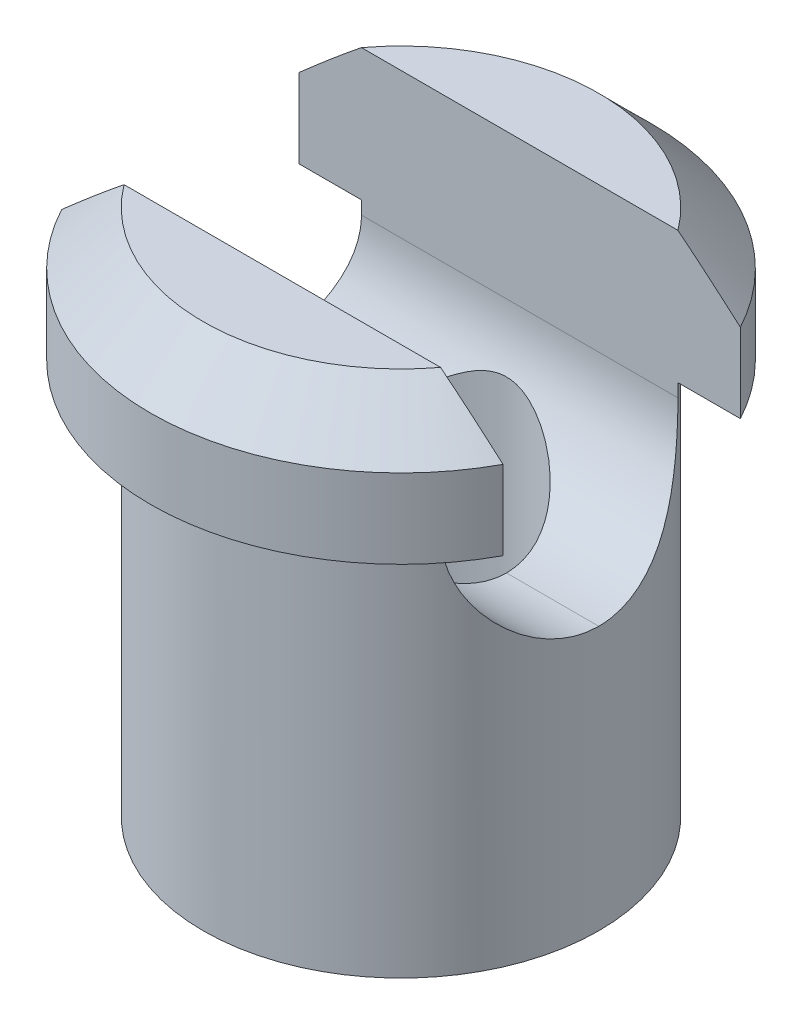
ISO-10303-21;
HEADER;
FILE_DESCRIPTION(('STEP AP214'),'2;1');
FILE_NAME('part.step','',(''),(''),'','','');
FILE_SCHEMA(('AUTOMOTIVE_DESIGN { 1 0 10303 214 1 1 1 1 }'));
ENDSEC;
DATA;
#1=APPLICATION_CONTEXT('core data for automotive mechanical design processes');
#2=APPLICATION_PROTOCOL_DEFINITION('international standard','automotive_design',2000,#1);
#3=PRODUCT_CONTEXT('',#1,'mechanical');
#4=PRODUCT('Part','Part','',(#3));
#5=PRODUCT_RELATED_PRODUCT_CATEGORY('part','',(#4));
#6=PRODUCT_DEFINITION_FORMATION('','',#4);
#7=PRODUCT_DEFINITION_CONTEXT('part definition',#1,'design');
#8=PRODUCT_DEFINITION('design','',#6,#7);
#9=PRODUCT_DEFINITION_SHAPE('','',#8);
#10=(LENGTH_UNIT() NAMED_UNIT(*) SI_UNIT(.MILLI.,.METRE.));
#11=(NAMED_UNIT(*) PLANE_ANGLE_UNIT() SI_UNIT($,.RADIAN.));
#12=(NAMED_UNIT(*) SI_UNIT($,.STERADIAN.) SOLID_ANGLE_UNIT());
#13=UNCERTAINTY_MEASURE_WITH_UNIT(LENGTH_MEASURE(1.E-05),#10,'distance_accuracy_value','');
#14=(GEOMETRIC_REPRESENTATION_CONTEXT(3) GLOBAL_UNCERTAINTY_ASSIGNED_CONTEXT((#13)) GLOBAL_UNIT_ASSIGNED_CONTEXT((#10,
#11,#12)) REPRESENTATION_CONTEXT('',''));
#15=CARTESIAN_POINT('',(0.,0.,0.));
#16=DIRECTION('',(0.,0.,1.));
#17=DIRECTION('',(1.,0.,0.));
#18=AXIS2_PLACEMENT_3D('',#15,#16,#17);
#19=CARTESIAN_POINT('',(7.5,15.,0.));
#20=DIRECTION('',(0.,1.,0.));
#21=DIRECTION('',(-1.,0.,0.));
#22=AXIS2_PLACEMENT_3D('',#19,#20,#21);
#23=PLANE('',#22);
#24=CARTESIAN_POINT('',(0.,15.,0.));
#25=DIRECTION('',(0.,1.,0.));
#26=DIRECTION('',(-1.,0.,0.));
#27=AXIS2_PLACEMENT_3D('',#24,#25,#26);
#28=CIRCLE('',#27,9.5);
#29=CARTESIAN_POINT('',(-8.36660026534076,15.,4.5));
#30=VERTEX_POINT('',#29);
#31=CARTESIAN_POINT('',(8.36660026534076,15.,4.5));
#32=VERTEX_POINT('',#31);
#33=EDGE_CURVE('E173',#30,#32,#28,.T.);
#34=ORIENTED_EDGE('',*,*,#33,.F.);
#35=DIRECTION('',(1.,0.,0.));
#36=VECTOR('',#35,1.);
#37=CARTESIAN_POINT('',(7.5,15.,4.5));
#38=LINE('',#37,#36);
#39=CARTESIAN_POINT('',(-6.,15.,4.5));
#40=VERTEX_POINT('',#39);
#41=EDGE_CURVE('E289',#30,#40,#38,.T.);
#42=ORIENTED_EDGE('',*,*,#41,.T.);
#43=CARTESIAN_POINT('',(0.,15.,0.));
#44=DIRECTION('',(0.,1.,0.));
#45=DIRECTION('',(-1.,0.,0.));
#46=AXIS2_PLACEMENT_3D('',#43,#44,#45);
#47=CIRCLE('',#46,7.5);
#48=CARTESIAN_POINT('',(6.,15.,4.5));
#49=VERTEX_POINT('',#48);
#50=EDGE_CURVE('E174',#40,#49,#47,.T.);
#51=ORIENTED_EDGE('',*,*,#50,.T.);
#52=EDGE_CURVE('E294',#49,#32,#38,.T.);
#53=ORIENTED_EDGE('',*,*,#52,.T.);
#54=EDGE_LOOP('',(#34,#42,#51,#53));
#55=FACE_BOUND('',#54,.T.);
#56=ADVANCED_FACE('F39',(#55),#23,.F.);
#57=CARTESIAN_POINT('',(0.,20.,0.));
#58=DIRECTION('',(0.,1.,0.));
#59=DIRECTION('',(-1.,0.,0.));
#60=AXIS2_PLACEMENT_3D('',#57,#58,#59);
#61=CYLINDRICAL_SURFACE('',#60,9.5);
#62=ORIENTED_EDGE('',*,*,#33,.T.);
#63=DIRECTION('',(0.,1.,0.));
#64=VECTOR('',#63,1.);
#65=CARTESIAN_POINT('',(8.36660026534076,20.,4.5));
#66=LINE('',#65,#64);
#67=CARTESIAN_POINT('',(8.36660026534076,18.,4.5));
#68=VERTEX_POINT('',#67);
#69=EDGE_CURVE('E297',#32,#68,#66,.T.);
#70=ORIENTED_EDGE('',*,*,#69,.T.);
#71=CARTESIAN_POINT('',(0.,18.,0.));
#72=DIRECTION('',(0.,1.,0.));
#73=DIRECTION('',(-1.,0.,0.));
#74=AXIS2_PLACEMENT_3D('',#71,#72,#73);
#75=CIRCLE('',#74,9.5);
#76=CARTESIAN_POINT('',(-8.36660026534076,18.,4.5));
#77=VERTEX_POINT('',#76);
#78=EDGE_CURVE('E162',#77,#68,#75,.T.);
#79=ORIENTED_EDGE('',*,*,#78,.F.);
#80=DIRECTION('',(0.,1.,0.));
#81=VECTOR('',#80,1.);
#82=CARTESIAN_POINT('',(-8.36660026534076,20.,4.5));
#83=LINE('',#82,#81);
#84=EDGE_CURVE('E137',#77,#30,#83,.F.);
#85=ORIENTED_EDGE('',*,*,#84,.T.);
#86=EDGE_LOOP('',(#62,#70,#79,#85));
#87=FACE_BOUND('',#86,.T.);
#88=ADVANCED_FACE('F312',(#87),#61,.T.);
#89=CARTESIAN_POINT('',(0.,18.,0.));
#90=DIRECTION('',(0.,-1.,0.));
#91=DIRECTION('',(1.,0.,0.));
#92=AXIS2_PLACEMENT_3D('',#89,#90,#91);
#93=CONICAL_SURFACE('',#92,9.5,0.785398163397449);
#94=ORIENTED_EDGE('',*,*,#78,.T.);
#95=CARTESIAN_POINT('',(8.36739508389559,17.9993,4.5));
#96=CARTESIAN_POINT('',(8.24484691919446,18.1072272297093,4.5));
#97=CARTESIAN_POINT('',(8.1220377160539,18.2148580709691,4.5));
#98=CARTESIAN_POINT('',(7.87582689736761,18.429443299208,4.5));
#99=CARTESIAN_POINT('',(7.75242527369194,18.5363976768568,4.5));
#100=CARTESIAN_POINT('',(7.3811300628873,18.8562033772271,4.5));
#101=CARTESIAN_POINT('',(7.13224632837708,19.0679087898725,4.5));
#102=CARTESIAN_POINT('',(6.62684988311126,19.4909014074442,4.5));
#103=CARTESIAN_POINT('',(6.37027945700601,19.7021198713915,4.5));
#104=CARTESIAN_POINT('',(5.85268429423352,20.1189195967068,4.5));
#105=CARTESIAN_POINT('',(5.59166061144087,20.3245021626086,4.5));
#106=CARTESIAN_POINT('',(5.06943073572236,20.7234779119315,4.5));
#107=CARTESIAN_POINT('',(4.8083546032396,20.9170396814306,4.5));
#108=CARTESIAN_POINT('',(4.41090845389738,21.1994056214214,4.5));
#109=CARTESIAN_POINT('',(4.27739880217188,21.2922343584723,4.5));
#110=CARTESIAN_POINT('',(4.00815368917608,21.4745984273772,4.5));
#111=CARTESIAN_POINT('',(3.87241837903649,21.5641339815229,4.5));
#112=CARTESIAN_POINT('',(3.599032487374,21.7387476654647,4.5));
#113=CARTESIAN_POINT('',(3.46139448927548,21.823845420172,4.5));
#114=CARTESIAN_POINT('',(3.18315198654476,21.9891085949656,4.5));
#115=CARTESIAN_POINT('',(3.04254715226672,22.0692734630409,4.5));
#116=CARTESIAN_POINT('',(2.75815917084868,22.223336853827,4.5));
#117=CARTESIAN_POINT('',(2.61438038120883,22.2972433669135,4.5));
#118=CARTESIAN_POINT('',(2.32313150811483,22.4373280666446,4.5));
#119=CARTESIAN_POINT('',(2.17566272047391,22.5035089213037,4.5));
#120=CARTESIAN_POINT('',(1.88623432994353,22.6223363709474,4.5));
#121=CARTESIAN_POINT('',(1.74452042133827,22.6755758809567,4.5));
#122=CARTESIAN_POINT('',(1.45759818366263,22.7717510084951,4.5));
#123=CARTESIAN_POINT('',(1.31238998422866,22.8146870076328,4.5));
#124=CARTESIAN_POINT('',(1.01967144860027,22.8880817033143,4.5));
#125=CARTESIAN_POINT('',(0.872178588657592,22.9186090195619,4.5));
#126=CARTESIAN_POINT('',(0.574971298223772,22.965786623751,4.5));
#127=CARTESIAN_POINT('',(0.42525719098821,22.9824389111341,4.5));
#128=CARTESIAN_POINT('',(0.123438288138011,23.0008507737561,4.5));
#129=CARTESIAN_POINT('',(-0.0286756144376807,23.0024644381601,4.5));
#130=CARTESIAN_POINT('',(-0.332279195748636,22.9903002271874,4.5));
#131=CARTESIAN_POINT('',(-0.483768844593605,22.9765216232043,4.5));
#132=CARTESIAN_POINT('',(-0.785377131595204,22.9344338258627,4.5));
#133=CARTESIAN_POINT('',(-0.935486520523537,22.9060594605829,4.5));
#134=CARTESIAN_POINT('',(-1.23265623196657,22.8364655604322,4.5));
#135=CARTESIAN_POINT('',(-1.37971603228179,22.7952438446898,4.5));
#136=CARTESIAN_POINT('',(-1.79353536396103,22.6624389693651,4.5));
#137=CARTESIAN_POINT('',(-2.05611389092435,22.5577822269071,4.5));
#138=CARTESIAN_POINT('',(-2.4410698008541,22.381817719934,4.5));
#139=CARTESIAN_POINT('',(-2.56802158092749,22.3199305832575,4.5));
#140=CARTESIAN_POINT('',(-2.81923944498322,22.190904466145,4.5));
#141=CARTESIAN_POINT('',(-2.94350578542213,22.1237659900603,4.5));
#142=CARTESIAN_POINT('',(-3.19085265476483,21.9844778477599,4.5));
#143=CARTESIAN_POINT('',(-3.31390803050425,21.9122839262557,4.5));
#144=CARTESIAN_POINT('',(-3.55781880473298,21.764261225469,4.5));
#145=CARTESIAN_POINT('',(-3.67867402737827,21.6884321573973,4.5));
#146=CARTESIAN_POINT('',(-4.03813473919927,21.4565845661693,4.5));
#147=CARTESIAN_POINT('',(-4.27384912359941,21.2960823793437,4.5));
#148=CARTESIAN_POINT('',(-4.67886036795023,21.0094659594567,4.5));
#149=CARTESIAN_POINT('',(-4.84951390703101,20.8852412102696,4.5));
#150=CARTESIAN_POINT('',(-5.18811523949353,20.6331417175974,4.5));
#151=CARTESIAN_POINT('',(-5.35606291709447,20.5052668185719,4.5));
#152=CARTESIAN_POINT('',(-5.68977686145292,20.2465551777567,4.5));
#153=CARTESIAN_POINT('',(-5.85554208962871,20.1157171010707,4.5));
#154=CARTESIAN_POINT('',(-6.18518437634805,19.851681865574,4.5));
#155=CARTESIAN_POINT('',(-6.34906140565359,19.718484670314,4.5));
#156=CARTESIAN_POINT('',(-6.66926786285808,19.4550537817244,4.5));
#157=CARTESIAN_POINT('',(-6.82565442329283,19.3248894180685,4.5));
#158=CARTESIAN_POINT('',(-7.13716501381201,19.0630569270435,4.5));
#159=CARTESIAN_POINT('',(-7.29228903154353,18.9313887849914,4.5));
#160=CARTESIAN_POINT('',(-7.60128256879623,18.6669309791805,4.5));
#161=CARTESIAN_POINT('',(-7.7551532764538,18.534142702068,4.5));
#162=CARTESIAN_POINT('',(-8.06194774727392,18.2674869096463,4.5));
#163=CARTESIAN_POINT('',(-8.21487154282353,18.1336194316134,4.5));
#164=CARTESIAN_POINT('',(-8.36739508389558,17.9993,4.5));
#165=B_SPLINE_CURVE_WITH_KNOTS('',3,(#95,#96,#97,#98,#99,#100,#101,#102,#103,#104,#105,#106,
#107,#108,#109,#110,#111,#112,#113,#114,#115,#116,#117,#118,#119,#120,#121,#122,#123,#124,#125,
#126,#127,#128,#129,#130,#131,#132,#133,#134,#135,#136,#137,#138,#139,#140,#141,#142,#143,#144,
#145,#146,#147,#148,#149,#150,#151,#152,#153,#154,#155,#156,#157,#158,#159,#160,#161,#162,#163,
#164),.UNSPECIFIED.,.F.,.F.,(4,2,2,2,2,2,2,2,2,2,2,2,2,2,2,2,2,2,2,2,2,2,2,2,2,2,2,2,2,2,2,2,2,
2,4),(0.,0.489894153909747,0.979795050092078,1.9599978180971,2.95692167158388,3.95361278600887,
4.92840150344141,5.41619368096687,5.90395287159404,6.38933112824629,6.874763602369,
7.35956664846183,7.84420177200372,8.29802972351968,8.75184086412734,9.2031071334878,
9.65430836250152,10.1098828247528,10.5654788529277,11.0231270645946,11.4808530056017,
12.3265013487016,12.7501457842116,13.1737495817332,13.6016888317825,14.0296621354083,
14.884869173537,15.5180643314824,16.1512865115713,16.784799864076,17.418323013137,
18.0287183007725,18.6391195534515,19.2488521108444,19.858563697173),.UNSPECIFIED.);
#166=CARTESIAN_POINT('',(5.99999999999999,20.,4.5));
#167=VERTEX_POINT('',#166);
#168=EDGE_CURVE('E145',#68,#167,#165,.T.);
#169=ORIENTED_EDGE('',*,*,#168,.T.);
#170=CARTESIAN_POINT('',(0.,20.,0.));
#171=DIRECTION('',(0.,1.,0.));
#172=DIRECTION('',(-1.,0.,0.));
#173=AXIS2_PLACEMENT_3D('',#170,#171,#172);
#174=CIRCLE('',#173,7.49999999999999);
#175=CARTESIAN_POINT('',(-5.99999999999999,20.,4.5));
#176=VERTEX_POINT('',#175);
#177=EDGE_CURVE('E149',#176,#167,#174,.T.);
#178=ORIENTED_EDGE('',*,*,#177,.F.);
#179=EDGE_CURVE('E130',#176,#77,#165,.T.);
#180=ORIENTED_EDGE('',*,*,#179,.T.);
#181=EDGE_LOOP('',(#94,#169,#178,#180));
#182=FACE_BOUND('',#181,.T.);
#183=ADVANCED_FACE('F154',(#182),#93,.T.);
#184=CARTESIAN_POINT('',(7.49999999999999,20.,0.));
#185=DIRECTION('',(0.,-1.,0.));
#186=DIRECTION('',(1.,0.,0.));
#187=AXIS2_PLACEMENT_3D('',#184,#185,#186);
#188=PLANE('',#187);
#189=ORIENTED_EDGE('',*,*,#177,.T.);
#190=DIRECTION('',(1.,0.,0.));
#191=VECTOR('',#190,1.);
#192=CARTESIAN_POINT('',(-9.5,20.,4.5));
#193=LINE('',#192,#191);
#194=EDGE_CURVE('E134',#176,#167,#193,.T.);
#195=ORIENTED_EDGE('',*,*,#194,.F.);
#196=EDGE_LOOP('',(#189,#195));
#197=FACE_BOUND('',#196,.T.);
#198=ADVANCED_FACE('F148',(#197),#188,.F.);
#199=CARTESIAN_POINT('',(0.,0.,0.));
#200=DIRECTION('',(0.,1.,0.));
#201=DIRECTION('',(-1.,0.,0.));
#202=AXIS2_PLACEMENT_3D('',#199,#200,#201);
#203=PLANE('',#202);
#204=CARTESIAN_POINT('',(0.,0.,0.));
#205=DIRECTION('',(0.,-1.,0.));
#206=DIRECTION('',(1.,0.,0.));
#207=AXIS2_PLACEMENT_3D('',#204,#205,#206);
#208=CIRCLE('',#207,4.);
#209=CARTESIAN_POINT('',(4.,0.,0.));
#210=VERTEX_POINT('',#209);
#211=EDGE_CURVE('E165',#210,#210,#208,.T.);
#212=ORIENTED_EDGE('',*,*,#211,.F.);
#213=EDGE_LOOP('',(#212));
#214=FACE_BOUND('',#213,.T.);
#215=CARTESIAN_POINT('',(0.,0.,0.));
#216=DIRECTION('',(0.,1.,0.));
#217=DIRECTION('',(-1.,0.,0.));
#218=AXIS2_PLACEMENT_3D('',#215,#216,#217);
#219=CIRCLE('',#218,7.5);
#220=CARTESIAN_POINT('',(-7.5,0.,0.));
#221=VERTEX_POINT('',#220);
#222=EDGE_CURVE('E178',#221,#221,#219,.T.);
#223=ORIENTED_EDGE('',*,*,#222,.F.);
#224=EDGE_LOOP('',(#223));
#225=FACE_BOUND('',#224,.T.);
#226=ADVANCED_FACE('F215',(#214,#225),#203,.F.);
#227=CARTESIAN_POINT('',(0.,20.,0.));
#228=DIRECTION('',(0.,1.,0.));
#229=DIRECTION('',(-1.,0.,0.));
#230=AXIS2_PLACEMENT_3D('',#227,#228,#229);
#231=CYLINDRICAL_SURFACE('',#230,7.5);
#232=DIRECTION('',(0.,1.,0.));
#233=VECTOR('',#232,1.);
#234=CARTESIAN_POINT('',(6.,20.,-4.5));
#235=LINE('',#234,#233);
#236=CARTESIAN_POINT('',(6.,15.,-4.5));
#237=VERTEX_POINT('',#236);
#238=CARTESIAN_POINT('',(6.,14.5,-4.5));
#239=VERTEX_POINT('',#238);
#240=EDGE_CURVE('E325',#237,#239,#235,.F.);
#241=ORIENTED_EDGE('',*,*,#240,.T.);
#242=CARTESIAN_POINT('',(6.,14.5,-4.5));
#243=CARTESIAN_POINT('',(5.99995179483679,14.3861873987763,-4.50002541288686));
#244=CARTESIAN_POINT('',(6.00323705584908,14.2724030969137,-4.49568328106251));
#245=CARTESIAN_POINT('',(6.01610753441909,14.0459483929675,-4.47846600678482));
#246=CARTESIAN_POINT('',(6.025686609677,13.9332770134618,-4.4655991837009));
#247=CARTESIAN_POINT('',(6.05067763750796,13.7107828937647,-4.43167158018456));
#248=CARTESIAN_POINT('',(6.06604181265092,13.6009444886329,-4.41067787838491));
#249=CARTESIAN_POINT('',(6.10197596202766,13.3839484347657,-4.36082960183109));
#250=CARTESIAN_POINT('',(6.12254698160926,13.2767913290918,-4.33197344848926));
#251=CARTESIAN_POINT('',(6.19081332781179,12.9611093782831,-4.23439881958348));
#252=CARTESIAN_POINT('',(6.24518632880575,12.757366926539,-4.15451599776942));
#253=CARTESIAN_POINT('',(6.36544732915564,12.3660260202434,-3.96779393040956));
#254=CARTESIAN_POINT('',(6.43136174731368,12.1784661113256,-3.86089258379867));
#255=CARTESIAN_POINT('',(6.57686634120047,11.8001400565597,-3.60812873696631));
#256=CARTESIAN_POINT('',(6.65714551946823,11.6117451042126,-3.45911303530544));
#257=CARTESIAN_POINT('',(6.81682191453012,11.2606290568208,-3.13271535629262));
#258=CARTESIAN_POINT('',(6.89621872431456,11.0979193870712,-2.95532082574971));
#259=CARTESIAN_POINT('',(7.01351141297607,10.8676030982223,-2.65962435942805));
#260=CARTESIAN_POINT('',(7.05415611776732,10.7898902981874,-2.55014303201056));
#261=CARTESIAN_POINT('',(7.13191893359114,10.6440852929838,-2.32379527903087));
#262=CARTESIAN_POINT('',(7.16903862261435,10.5759887763257,-2.20693219733319));
#263=CARTESIAN_POINT('',(7.23864595048767,10.4502182260111,-1.96663046048815));
#264=CARTESIAN_POINT('',(7.27114002970855,10.3925296705012,-1.84320128327493));
#265=CARTESIAN_POINT('',(7.33055492432762,10.2882458748013,-1.59052912216705));
#266=CARTESIAN_POINT('',(7.35747971475215,10.241642718926,-1.46129036556546));
#267=CARTESIAN_POINT('',(7.4003192525882,10.1680911165991,-1.22348789765087));
#268=CARTESIAN_POINT('',(7.41735622916451,10.1390846556363,-1.11575814227692));
#269=CARTESIAN_POINT('',(7.44687391073794,10.0890661862603,-0.897861074125226));
#270=CARTESIAN_POINT('',(7.45935570869715,10.0680522600804,-0.787694352806359));
#271=CARTESIAN_POINT('',(7.47951920353889,10.0341961272988,-0.565086649148773));
#272=CARTESIAN_POINT('',(7.48717574377888,10.0213967412209,-0.452636852020267));
#273=CARTESIAN_POINT('',(7.49742873390927,10.0042859419325,-0.226795824857999));
#274=CARTESIAN_POINT('',(7.50002204273153,9.99997979764293,-0.113404054224077));
#275=CARTESIAN_POINT('',(7.5,10.,0.));
#276=B_SPLINE_CURVE_WITH_KNOTS('',3,(#242,#243,#244,#245,#246,#247,#248,#249,#250,#251,#252,
#253,#254,#255,#256,#257,#258,#259,#260,#261,#262,#263,#264,#265,#266,#267,#268,#269,#270,#271,
#272,#273,#274,#275),.UNSPECIFIED.,.F.,.F.,(4,2,2,2,2,2,2,2,2,2,2,2,2,2,2,2,4),(0.,
0.341261757773518,0.68219096287419,1.02036418469491,1.35860535350921,2.03204615815233,
2.70704914593942,3.46393656597491,4.22115972074908,4.64150857043903,5.06166835299513,
5.48123728995438,5.90050572234968,6.23870881062981,6.57683069758032,6.91670112023389,
7.25678232080459),.UNSPECIFIED.);
#277=CARTESIAN_POINT('',(7.5,10.,0.));
#278=VERTEX_POINT('',#277);
#279=EDGE_CURVE('E64',#239,#278,#276,.T.);
#280=ORIENTED_EDGE('',*,*,#279,.T.);
#281=CARTESIAN_POINT('',(7.5,10.,0.));
#282=CARTESIAN_POINT('',(7.50002325630694,9.99997895327912,0.115712044065046));
#283=CARTESIAN_POINT('',(7.49732280902084,10.0044624241488,0.231408543481362));
#284=CARTESIAN_POINT('',(7.48664991104625,10.0222751572515,0.461816976040322));
#285=CARTESIAN_POINT('',(7.47868012079889,10.0355999555946,0.576529376454171));
#286=CARTESIAN_POINT('',(7.4577016270085,10.0708349644125,0.803507024958408));
#287=CARTESIAN_POINT('',(7.4447209576373,10.0926974173803,0.915782280588779));
#288=CARTESIAN_POINT('',(7.4140521236593,10.1447037968535,1.1377177857917));
#289=CARTESIAN_POINT('',(7.39636356824576,10.1748484108768,1.24737781744785));
#290=CARTESIAN_POINT('',(7.33688667235754,10.2770826442722,1.57097850971185));
#291=CARTESIAN_POINT('',(7.28863078723534,10.361064224819,1.7801160273152));
#292=CARTESIAN_POINT('',(7.17894259318037,10.5574334725609,2.18085871312114));
#293=CARTESIAN_POINT('',(7.11749526846876,10.6698535374312,2.37244354357427));
#294=CARTESIAN_POINT('',(6.98116895285505,10.92930854971,2.74887234667704));
#295=CARTESIAN_POINT('',(6.90562545372444,11.0783190012604,2.93210942140134));
#296=CARTESIAN_POINT('',(6.75090787854968,11.4024093586389,3.27265466855486));
#297=CARTESIAN_POINT('',(6.67172887761447,11.577525395734,3.42992625755736));
#298=CARTESIAN_POINT('',(6.55077356570006,11.8690841374275,3.6531833501287));
#299=CARTESIAN_POINT('',(6.50779808471827,11.9776509833785,3.72899044896288));
#300=CARTESIAN_POINT('',(6.42425172081734,12.2017772484358,3.87114690667347));
#301=CARTESIAN_POINT('',(6.38368147946976,12.3173385167642,3.93749374870122));
#302=CARTESIAN_POINT('',(6.30651340540028,12.5545812587562,4.05994045193591));
#303=CARTESIAN_POINT('',(6.26990442531298,12.6762440690391,4.11606938848589));
#304=CARTESIAN_POINT('',(6.20204016942095,12.9253148174766,4.21763315158229));
#305=CARTESIAN_POINT('',(6.17078076139529,13.0527182243833,4.26307624254092));
#306=CARTESIAN_POINT('',(6.12046865559375,13.2873165850765,4.33490463080028));
#307=CARTESIAN_POINT('',(6.10022437807672,13.3936505613132,4.36327617227646));
#308=CARTESIAN_POINT('',(6.06488056866518,13.6089064908613,4.41227062963133));
#309=CARTESIAN_POINT('',(6.04977928738951,13.717827550668,4.43289618054086));
#310=CARTESIAN_POINT('',(6.0252256941063,13.9383922168048,4.46621923296809));
#311=CARTESIAN_POINT('',(6.01581820601154,14.0500504048905,4.47885386068048));
#312=CARTESIAN_POINT('',(6.00317848689608,14.2744632176647,4.49576135681982));
#313=CARTESIAN_POINT('',(5.99995296785896,14.3872189006442,4.50002513684197));
#314=CARTESIAN_POINT('',(6.,14.5,4.5));
#315=B_SPLINE_CURVE_WITH_KNOTS('',3,(#281,#282,#283,#284,#285,#286,#287,#288,#289,#290,#291,
#292,#293,#294,#295,#296,#297,#298,#299,#300,#301,#302,#303,#304,#305,#306,#307,#308,#309,#310,
#311,#312,#313,#314),.UNSPECIFIED.,.F.,.F.,(4,2,2,2,2,2,2,2,2,2,2,2,2,2,2,2,4),(0.,
0.34699219205724,0.693809324705787,1.03871361461128,1.38364654433179,2.07177622302466,
2.76069339088735,3.50173730154465,4.24381653863494,4.66102323901179,5.07834072863425,
5.49445150628231,5.91023939835116,6.24555743106187,6.58076129174699,6.918570809536,
7.2567468918123),.UNSPECIFIED.);
#316=CARTESIAN_POINT('',(6.,14.5,4.5));
#317=VERTEX_POINT('',#316);
#318=EDGE_CURVE('E199',#278,#317,#315,.T.);
#319=ORIENTED_EDGE('',*,*,#318,.T.);
#320=DIRECTION('',(0.,1.,0.));
#321=VECTOR('',#320,1.);
#322=CARTESIAN_POINT('',(6.,20.,4.5));
#323=LINE('',#322,#321);
#324=EDGE_CURVE('E300',#317,#49,#323,.T.);
#325=ORIENTED_EDGE('',*,*,#324,.T.);
#326=ORIENTED_EDGE('',*,*,#50,.F.);
#327=DIRECTION('',(0.,1.,0.));
#328=VECTOR('',#327,1.);
#329=CARTESIAN_POINT('',(-6.,20.,4.5));
#330=LINE('',#329,#328);
#331=CARTESIAN_POINT('',(-6.,14.5,4.5));
#332=VERTEX_POINT('',#331);
#333=EDGE_CURVE('E293',#40,#332,#330,.F.);
#334=ORIENTED_EDGE('',*,*,#333,.T.);
#335=CARTESIAN_POINT('',(-6.,14.5,4.5));
#336=CARTESIAN_POINT('',(-5.99995179483679,14.3861873987763,4.50002541288686));
#337=CARTESIAN_POINT('',(-6.00323705584909,14.2724030969137,4.4956832810625));
#338=CARTESIAN_POINT('',(-6.01610753441909,14.0459483929675,4.47846600678482));
#339=CARTESIAN_POINT('',(-6.025686609677,13.9332770134618,4.4655991837009));
#340=CARTESIAN_POINT('',(-6.05067763750796,13.7107828937647,4.43167158018456));
#341=CARTESIAN_POINT('',(-6.06604181265093,13.6009444886329,4.41067787838491));
#342=CARTESIAN_POINT('',(-6.10197596202766,13.3839484347657,4.36082960183109));
#343=CARTESIAN_POINT('',(-6.12254698160926,13.2767913290918,4.33197344848926));
#344=CARTESIAN_POINT('',(-6.19081332781179,12.9611093782831,4.23439881958347));
#345=CARTESIAN_POINT('',(-6.24518632880576,12.757366926539,4.15451599776942));
#346=CARTESIAN_POINT('',(-6.36544732915564,12.3660260202434,3.96779393040955));
#347=CARTESIAN_POINT('',(-6.43136174731368,12.1784661113256,3.86089258379866));
#348=CARTESIAN_POINT('',(-6.57686634120047,11.8001400565597,3.60812873696631));
#349=CARTESIAN_POINT('',(-6.65714551946823,11.6117451042126,3.45911303530544));
#350=CARTESIAN_POINT('',(-6.81682191453012,11.2606290568208,3.13271535629262));
#351=CARTESIAN_POINT('',(-6.89621872431456,11.0979193870712,2.95532082574971));
#352=CARTESIAN_POINT('',(-7.01351141297607,10.8676030982223,2.65962435942805));
#353=CARTESIAN_POINT('',(-7.05415611776733,10.7898902981874,2.55014303201056));
#354=CARTESIAN_POINT('',(-7.13191893359114,10.6440852929838,2.32379527903087));
#355=CARTESIAN_POINT('',(-7.16903862261435,10.5759887763257,2.20693219733319));
#356=CARTESIAN_POINT('',(-7.23864595048767,10.4502182260111,1.96663046048815));
#357=CARTESIAN_POINT('',(-7.27114002970855,10.3925296705012,1.84320128327492));
#358=CARTESIAN_POINT('',(-7.33055492432762,10.2882458748013,1.59052912216705));
#359=CARTESIAN_POINT('',(-7.35747971475215,10.241642718926,1.46129036556546));
#360=CARTESIAN_POINT('',(-7.4003192525882,10.1680911165991,1.22348789765087));
#361=CARTESIAN_POINT('',(-7.41735622916452,10.1390846556363,1.11575814227692));
#362=CARTESIAN_POINT('',(-7.44687391073794,10.0890661862603,0.897861074125224));
#363=CARTESIAN_POINT('',(-7.45935570869715,10.0680522600804,0.787694352806357));
#364=CARTESIAN_POINT('',(-7.47951920353889,10.0341961272988,0.565086649148772));
#365=CARTESIAN_POINT('',(-7.48717574377888,10.0213967412209,0.452636852020266));
#366=CARTESIAN_POINT('',(-7.49742873390927,10.0042859419325,0.226795824858));
#367=CARTESIAN_POINT('',(-7.50002204273153,9.99997979764293,0.113404054224078));
#368=CARTESIAN_POINT('',(-7.5,10.,0.));
#369=B_SPLINE_CURVE_WITH_KNOTS('',3,(#335,#336,#337,#338,#339,#340,#341,#342,#343,#344,#345,
#346,#347,#348,#349,#350,#351,#352,#353,#354,#355,#356,#357,#358,#359,#360,#361,#362,#363,#364,
#365,#366,#367,#368),.UNSPECIFIED.,.F.,.F.,(4,2,2,2,2,2,2,2,2,2,2,2,2,2,2,2,4),(0.,
0.341261757773516,0.68219096287419,1.02036418469491,1.35860535350921,2.03204615815233,
2.70704914593942,3.46393656597491,4.22115972074908,4.64150857043903,5.06166835299513,
5.48123728995438,5.90050572234968,6.23870881062981,6.57683069758032,6.91670112023388,
7.25678232080458),.UNSPECIFIED.);
#370=CARTESIAN_POINT('',(-7.5,10.,0.));
#371=VERTEX_POINT('',#370);
#372=EDGE_CURVE('E57',#332,#371,#369,.T.);
#373=ORIENTED_EDGE('',*,*,#372,.T.);
#374=CARTESIAN_POINT('',(-7.5,10.,0.));
#375=CARTESIAN_POINT('',(-7.50002325630694,9.99997895327912,-0.115712044065045));
#376=CARTESIAN_POINT('',(-7.49732280902084,10.0044624241488,-0.231408543481361));
#377=CARTESIAN_POINT('',(-7.48664991104625,10.0222751572515,-0.461816976040321));
#378=CARTESIAN_POINT('',(-7.47868012079889,10.0355999555946,-0.57652937645417));
#379=CARTESIAN_POINT('',(-7.4577016270085,10.0708349644125,-0.803507024958407));
#380=CARTESIAN_POINT('',(-7.4447209576373,10.0926974173803,-0.915782280588778));
#381=CARTESIAN_POINT('',(-7.4140521236593,10.1447037968535,-1.1377177857917));
#382=CARTESIAN_POINT('',(-7.39636356824576,10.1748484108768,-1.24737781744785));
#383=CARTESIAN_POINT('',(-7.33688667235755,10.2770826442722,-1.57097850971184));
#384=CARTESIAN_POINT('',(-7.28863078723534,10.361064224819,-1.78011602731519));
#385=CARTESIAN_POINT('',(-7.17894259318037,10.5574334725609,-2.18085871312114));
#386=CARTESIAN_POINT('',(-7.11749526846876,10.6698535374312,-2.37244354357427));
#387=CARTESIAN_POINT('',(-6.98116895285505,10.92930854971,-2.74887234667704));
#388=CARTESIAN_POINT('',(-6.90562545372445,11.0783190012604,-2.93210942140134));
#389=CARTESIAN_POINT('',(-6.75090787854969,11.4024093586389,-3.27265466855486));
#390=CARTESIAN_POINT('',(-6.67172887761447,11.577525395734,-3.42992625755736));
#391=CARTESIAN_POINT('',(-6.55077356570007,11.8690841374275,-3.6531833501287));
#392=CARTESIAN_POINT('',(-6.50779808471827,11.9776509833785,-3.72899044896288));
#393=CARTESIAN_POINT('',(-6.42425172081734,12.2017772484358,-3.87114690667347));
#394=CARTESIAN_POINT('',(-6.38368147946976,12.3173385167642,-3.93749374870122));
#395=CARTESIAN_POINT('',(-6.30651340540028,12.5545812587562,-4.05994045193591));
#396=CARTESIAN_POINT('',(-6.26990442531298,12.6762440690391,-4.11606938848589));
#397=CARTESIAN_POINT('',(-6.20204016942095,12.9253148174766,-4.21763315158229));
#398=CARTESIAN_POINT('',(-6.1707807613953,13.0527182243833,-4.26307624254092));
#399=CARTESIAN_POINT('',(-6.12046865559375,13.2873165850765,-4.33490463080029));
#400=CARTESIAN_POINT('',(-6.10022437807672,13.3936505613132,-4.36327617227646));
#401=CARTESIAN_POINT('',(-6.06488056866518,13.6089064908613,-4.41227062963133));
#402=CARTESIAN_POINT('',(-6.04977928738951,13.717827550668,-4.43289618054086));
#403=CARTESIAN_POINT('',(-6.02522569410631,13.9383922168048,-4.46621923296809));
#404=CARTESIAN_POINT('',(-6.01581820601154,14.0500504048905,-4.47885386068048));
#405=CARTESIAN_POINT('',(-6.00317848689608,14.2744632176647,-4.49576135681982));
#406=CARTESIAN_POINT('',(-5.99995296785896,14.3872189006442,-4.50002513684197));
#407=CARTESIAN_POINT('',(-6.,14.5,-4.5));
#408=B_SPLINE_CURVE_WITH_KNOTS('',3,(#374,#375,#376,#377,#378,#379,#380,#381,#382,#383,#384,
#385,#386,#387,#388,#389,#390,#391,#392,#393,#394,#395,#396,#397,#398,#399,#400,#401,#402,#403,
#404,#405,#406,#407),.UNSPECIFIED.,.F.,.F.,(4,2,2,2,2,2,2,2,2,2,2,2,2,2,2,2,4),(0.,
0.34699219205724,0.693809324705787,1.03871361461128,1.38364654433179,2.07177622302466,
2.76069339088736,3.50173730154465,4.24381653863494,4.66102323901179,5.07834072863426,
5.49445150628231,5.91023939835116,6.24555743106187,6.58076129174699,6.918570809536,
7.2567468918123),.UNSPECIFIED.);
#409=CARTESIAN_POINT('',(-6.,14.5,-4.5));
#410=VERTEX_POINT('',#409);
#411=EDGE_CURVE('E11',#371,#410,#408,.T.);
#412=ORIENTED_EDGE('',*,*,#411,.T.);
#413=DIRECTION('',(0.,1.,0.));
#414=VECTOR('',#413,1.);
#415=CARTESIAN_POINT('',(-6.,20.,-4.5));
#416=LINE('',#415,#414);
#417=CARTESIAN_POINT('',(-6.,15.,-4.5));
#418=VERTEX_POINT('',#417);
#419=EDGE_CURVE('E143',#410,#418,#416,.T.);
#420=ORIENTED_EDGE('',*,*,#419,.T.);
#421=EDGE_CURVE('E179',#237,#418,#47,.T.);
#422=ORIENTED_EDGE('',*,*,#421,.F.);
#423=EDGE_LOOP('',(#241,#280,#319,#325,#326,#334,#373,#412,#420,#422));
#424=FACE_BOUND('',#423,.T.);
#425=ORIENTED_EDGE('',*,*,#222,.T.);
#426=EDGE_LOOP('',(#425));
#427=FACE_BOUND('',#426,.T.);
#428=ADVANCED_FACE('F229',(#424,#427),#231,.T.);
#429=CARTESIAN_POINT('',(8.36660026534076,15.,-4.5));
#430=VERTEX_POINT('',#429);
#431=CARTESIAN_POINT('',(-8.36660026534076,15.,-4.5));
#432=VERTEX_POINT('',#431);
#433=EDGE_CURVE('E169',#430,#432,#28,.T.);
#434=ORIENTED_EDGE('',*,*,#433,.F.);
#435=DIRECTION('',(-1.,0.,0.));
#436=VECTOR('',#435,1.);
#437=CARTESIAN_POINT('',(7.5,15.,-4.5));
#438=LINE('',#437,#436);
#439=EDGE_CURVE('E323',#430,#237,#438,.T.);
#440=ORIENTED_EDGE('',*,*,#439,.T.);
#441=ORIENTED_EDGE('',*,*,#421,.T.);
#442=EDGE_CURVE('E322',#418,#432,#438,.T.);
#443=ORIENTED_EDGE('',*,*,#442,.T.);
#444=EDGE_LOOP('',(#434,#440,#441,#443));
#445=FACE_BOUND('',#444,.T.);
#446=ADVANCED_FACE('F233',(#445),#23,.F.);
#447=ORIENTED_EDGE('',*,*,#433,.T.);
#448=DIRECTION('',(0.,1.,0.));
#449=VECTOR('',#448,1.);
#450=CARTESIAN_POINT('',(-8.36660026534076,20.,-4.5));
#451=LINE('',#450,#449);
#452=CARTESIAN_POINT('',(-8.36660026534076,18.,-4.5));
#453=VERTEX_POINT('',#452);
#454=EDGE_CURVE('E330',#432,#453,#451,.T.);
#455=ORIENTED_EDGE('',*,*,#454,.T.);
#456=CARTESIAN_POINT('',(8.36660026534076,18.,-4.5));
#457=VERTEX_POINT('',#456);
#458=EDGE_CURVE('E156',#457,#453,#75,.T.);
#459=ORIENTED_EDGE('',*,*,#458,.F.);
#460=DIRECTION('',(0.,1.,0.));
#461=VECTOR('',#460,1.);
#462=CARTESIAN_POINT('',(8.36660026534076,20.,-4.5));
#463=LINE('',#462,#461);
#464=EDGE_CURVE('E269',#457,#430,#463,.F.);
#465=ORIENTED_EDGE('',*,*,#464,.T.);
#466=EDGE_LOOP('',(#447,#455,#459,#465));
#467=FACE_BOUND('',#466,.T.);
#468=ADVANCED_FACE('F340',(#467),#61,.T.);
#469=ORIENTED_EDGE('',*,*,#458,.T.);
#470=CARTESIAN_POINT('',(-8.36739508389558,17.9993,-4.5));
#471=CARTESIAN_POINT('',(-8.24484691919446,18.1072272297093,-4.5));
#472=CARTESIAN_POINT('',(-8.1220377160539,18.2148580709691,-4.5));
#473=CARTESIAN_POINT('',(-7.87582689736761,18.429443299208,-4.5));
#474=CARTESIAN_POINT('',(-7.75242527369194,18.5363976768568,-4.5));
#475=CARTESIAN_POINT('',(-7.3811300628873,18.8562033772271,-4.5));
#476=CARTESIAN_POINT('',(-7.13224632837708,19.0679087898725,-4.5));
#477=CARTESIAN_POINT('',(-6.62684988311126,19.4909014074442,-4.5));
#478=CARTESIAN_POINT('',(-6.370279457006,19.7021198713915,-4.5));
#479=CARTESIAN_POINT('',(-5.85268429423352,20.1189195967068,-4.5));
#480=CARTESIAN_POINT('',(-5.59166061144087,20.3245021626086,-4.5));
#481=CARTESIAN_POINT('',(-5.06943073572236,20.7234779119316,-4.5));
#482=CARTESIAN_POINT('',(-4.8083546032396,20.9170396814306,-4.5));
#483=CARTESIAN_POINT('',(-4.41090845389738,21.1994056214214,-4.5));
#484=CARTESIAN_POINT('',(-4.27739880217188,21.2922343584723,-4.5));
#485=CARTESIAN_POINT('',(-4.00815368917608,21.4745984273772,-4.5));
#486=CARTESIAN_POINT('',(-3.87241837903649,21.5641339815229,-4.5));
#487=CARTESIAN_POINT('',(-3.599032487374,21.7387476654647,-4.5));
#488=CARTESIAN_POINT('',(-3.46139448927548,21.823845420172,-4.5));
#489=CARTESIAN_POINT('',(-3.18315198654476,21.9891085949656,-4.5));
#490=CARTESIAN_POINT('',(-3.04254715226672,22.0692734630409,-4.5));
#491=CARTESIAN_POINT('',(-2.75815917084868,22.223336853827,-4.5));
#492=CARTESIAN_POINT('',(-2.61438038120882,22.2972433669135,-4.5));
#493=CARTESIAN_POINT('',(-2.32313150811483,22.4373280666446,-4.5));
#494=CARTESIAN_POINT('',(-2.17566272047391,22.5035089213037,-4.5));
#495=CARTESIAN_POINT('',(-1.88623432994352,22.6223363709474,-4.5));
#496=CARTESIAN_POINT('',(-1.74452042133827,22.6755758809567,-4.5));
#497=CARTESIAN_POINT('',(-1.45759818366263,22.7717510084951,-4.5));
#498=CARTESIAN_POINT('',(-1.31238998422866,22.8146870076328,-4.5));
#499=CARTESIAN_POINT('',(-1.01967144860026,22.8880817033143,-4.5));
#500=CARTESIAN_POINT('',(-0.87217858865759,22.9186090195619,-4.5));
#501=CARTESIAN_POINT('',(-0.57497129822377,22.965786623751,-4.5));
#502=CARTESIAN_POINT('',(-0.425257190988208,22.9824389111341,-4.5));
#503=CARTESIAN_POINT('',(-0.123438288138009,23.0008507737561,-4.5));
#504=CARTESIAN_POINT('',(0.0286756144376822,23.0024644381601,-4.5));
#505=CARTESIAN_POINT('',(0.332279195748637,22.9903002271874,-4.5));
#506=CARTESIAN_POINT('',(0.483768844593606,22.9765216232043,-4.5));
#507=CARTESIAN_POINT('',(0.785377131595205,22.9344338258627,-4.5));
#508=CARTESIAN_POINT('',(0.935486520523537,22.9060594605829,-4.5));
#509=CARTESIAN_POINT('',(1.23265623196657,22.8364655604322,-4.5));
#510=CARTESIAN_POINT('',(1.37971603228179,22.7952438446898,-4.5));
#511=CARTESIAN_POINT('',(1.79353536396103,22.6624389693651,-4.5));
#512=CARTESIAN_POINT('',(2.05611389092435,22.5577822269071,-4.5));
#513=CARTESIAN_POINT('',(2.44106980085411,22.381817719934,-4.5));
#514=CARTESIAN_POINT('',(2.5680215809275,22.3199305832575,-4.5));
#515=CARTESIAN_POINT('',(2.81923944498322,22.190904466145,-4.5));
#516=CARTESIAN_POINT('',(2.94350578542213,22.1237659900603,-4.5));
#517=CARTESIAN_POINT('',(3.19085265476483,21.9844778477599,-4.5));
#518=CARTESIAN_POINT('',(3.31390803050426,21.9122839262557,-4.5));
#519=CARTESIAN_POINT('',(3.55781880473298,21.764261225469,-4.5));
#520=CARTESIAN_POINT('',(3.67867402737827,21.6884321573973,-4.5));
#521=CARTESIAN_POINT('',(4.03813473919928,21.4565845661693,-4.5));
#522=CARTESIAN_POINT('',(4.27384912359941,21.2960823793437,-4.5));
#523=CARTESIAN_POINT('',(4.67886036795023,21.0094659594567,-4.5));
#524=CARTESIAN_POINT('',(4.84951390703101,20.8852412102696,-4.5));
#525=CARTESIAN_POINT('',(5.18811523949353,20.6331417175974,-4.5));
#526=CARTESIAN_POINT('',(5.35606291709447,20.5052668185719,-4.5));
#527=CARTESIAN_POINT('',(5.68977686145292,20.2465551777566,-4.5));
#528=CARTESIAN_POINT('',(5.85554208962871,20.1157171010707,-4.5));
#529=CARTESIAN_POINT('',(6.18518437634805,19.851681865574,-4.5));
#530=CARTESIAN_POINT('',(6.34906140565359,19.718484670314,-4.5));
#531=CARTESIAN_POINT('',(6.66926786285808,19.4550537817244,-4.5));
#532=CARTESIAN_POINT('',(6.82565442329283,19.3248894180685,-4.5));
#533=CARTESIAN_POINT('',(7.13716501381201,19.0630569270435,-4.5));
#534=CARTESIAN_POINT('',(7.29228903154353,18.9313887849914,-4.5));
#535=CARTESIAN_POINT('',(7.60128256879623,18.6669309791805,-4.5));
#536=CARTESIAN_POINT('',(7.7551532764538,18.534142702068,-4.5));
#537=CARTESIAN_POINT('',(8.06194774727391,18.2674869096463,-4.5));
#538=CARTESIAN_POINT('',(8.21487154282353,18.1336194316134,-4.5));
#539=CARTESIAN_POINT('',(8.36739508389558,17.9993,-4.5));
#540=B_SPLINE_CURVE_WITH_KNOTS('',3,(#470,#471,#472,#473,#474,#475,#476,#477,#478,#479,#480,
#481,#482,#483,#484,#485,#486,#487,#488,#489,#490,#491,#492,#493,#494,#495,#496,#497,#498,#499,
#500,#501,#502,#503,#504,#505,#506,#507,#508,#509,#510,#511,#512,#513,#514,#515,#516,#517,#518,
#519,#520,#521,#522,#523,#524,#525,#526,#527,#528,#529,#530,#531,#532,#533,#534,#535,#536,#537,
#538,#539),.UNSPECIFIED.,.F.,.F.,(4,2,2,2,2,2,2,2,2,2,2,2,2,2,2,2,2,2,2,2,2,2,2,2,2,2,2,2,2,2,2,
2,2,2,4),(0.,0.489894153909746,0.979795050092077,1.95999781809711,2.95692167158388,
3.95361278600888,4.92840150344141,5.41619368096687,5.90395287159404,6.38933112824629,
6.874763602369,7.35956664846183,7.84420177200372,8.29802972351967,8.75184086412734,
9.20310713348779,9.65430836250152,10.1098828247528,10.5654788529277,11.0231270645946,
11.4808530056017,12.3265013487016,12.7501457842116,13.1737495817332,13.6016888317825,
14.0296621354083,14.884869173537,15.5180643314824,16.1512865115713,16.784799864076,
17.418323013137,18.0287183007725,18.6391195534515,19.2488521108444,19.858563697173),.UNSPECIFIED.);
#541=CARTESIAN_POINT('',(-5.99999999999999,20.,-4.5));
#542=VERTEX_POINT('',#541);
#543=EDGE_CURVE('E270',#453,#542,#540,.T.);
#544=ORIENTED_EDGE('',*,*,#543,.T.);
#545=CARTESIAN_POINT('',(5.99999999999999,20.,-4.5));
#546=VERTEX_POINT('',#545);
#547=EDGE_CURVE('E157',#546,#542,#174,.T.);
#548=ORIENTED_EDGE('',*,*,#547,.F.);
#549=EDGE_CURVE('E151',#546,#457,#540,.T.);
#550=ORIENTED_EDGE('',*,*,#549,.T.);
#551=EDGE_LOOP('',(#469,#544,#548,#550));
#552=FACE_BOUND('',#551,.T.);
#553=ADVANCED_FACE('F272',(#552),#93,.T.);
#554=ORIENTED_EDGE('',*,*,#547,.T.);
#555=DIRECTION('',(1.,0.,0.));
#556=VECTOR('',#555,1.);
#557=CARTESIAN_POINT('',(-9.5,20.,-4.5));
#558=LINE('',#557,#556);
#559=EDGE_CURVE('E152',#542,#546,#558,.T.);
#560=ORIENTED_EDGE('',*,*,#559,.T.);
#561=EDGE_LOOP('',(#554,#560));
#562=FACE_BOUND('',#561,.T.);
#563=ADVANCED_FACE('F343',(#562),#188,.F.);
#564=CARTESIAN_POINT('',(0.,20.,0.));
#565=DIRECTION('',(0.,-1.,0.));
#566=DIRECTION('',(1.,0.,0.));
#567=AXIS2_PLACEMENT_3D('',#564,#565,#566);
#568=CYLINDRICAL_SURFACE('',#567,4.);
#569=CARTESIAN_POINT('',(-4.,10.,0.));
#570=CARTESIAN_POINT('',(-4.0000219912914,9.99997732193656,0.0935853771199938));
#571=CARTESIAN_POINT('',(-3.99671641997791,10.0029186662344,0.187153695596283));
#572=CARTESIAN_POINT('',(-3.98362006793451,10.0145554934882,0.373408177306846));
#573=CARTESIAN_POINT('',(-3.97383405883509,10.02324674271,0.466094938746207));
#574=CARTESIAN_POINT('',(-3.94805038273976,10.0461176093488,0.649139247617644));
#575=CARTESIAN_POINT('',(-3.93210330162292,10.0602525282485,0.739509532032771));
#576=CARTESIAN_POINT('',(-3.89430198892575,10.0936963882276,0.918012785046353));
#577=CARTESIAN_POINT('',(-3.87244696841952,10.1130060203174,1.00614545312056));
#578=CARTESIAN_POINT('',(-3.79867132822745,10.1780382361203,1.26583389196251));
#579=CARTESIAN_POINT('',(-3.73844375257124,10.2309503708091,1.43333897975874));
#580=CARTESIAN_POINT('',(-3.59907193206638,10.3524507629738,1.75427207051843));
#581=CARTESIAN_POINT('',(-3.51988861426003,10.4210713869813,1.90767007885587));
#582=CARTESIAN_POINT('',(-3.31158544232242,10.5996624540369,2.25590417332338));
#583=CARTESIAN_POINT('',(-3.17505197781345,10.7153037771076,2.44345201132676));
#584=CARTESIAN_POINT('',(-2.95231845286518,10.8993810014275,2.70125917616897));
#585=CARTESIAN_POINT('',(-2.87494580853785,10.9626198154917,2.78338909629808));
#586=CARTESIAN_POINT('',(-2.71466861676367,11.0916052507428,2.93991507084606));
#587=CARTESIAN_POINT('',(-2.63176596754597,11.1573510081108,3.01431375688559));
#588=CARTESIAN_POINT('',(-2.45882157722949,11.2917650940486,3.15706577466863));
#589=CARTESIAN_POINT('',(-2.36866017793381,11.3604658803471,3.22524264464021));
#590=CARTESIAN_POINT('',(-2.1829799370552,11.4980825214527,3.35370653170673));
#591=CARTESIAN_POINT('',(-2.08745953133716,11.5669984334476,3.41399122801562));
#592=CARTESIAN_POINT('',(-1.89110742442452,11.7033423230793,3.52654225298203));
#593=CARTESIAN_POINT('',(-1.79028594483655,11.7707728324895,3.57882330393206));
#594=CARTESIAN_POINT('',(-1.58276923513789,11.9021734546809,3.67531336115042));
#595=CARTESIAN_POINT('',(-1.47607818021622,11.9661459646229,3.71952801106334));
#596=CARTESIAN_POINT('',(-1.25484080765753,12.0883594093459,3.79991899362291));
#597=CARTESIAN_POINT('',(-1.14022328850886,12.1465324983373,3.83600527481247));
#598=CARTESIAN_POINT('',(-0.903426750128697,12.2516737892134,3.89855965356076));
#599=CARTESIAN_POINT('',(-0.781259009284746,12.2986582182359,3.92504170985336));
#600=CARTESIAN_POINT('',(-0.550202008717927,12.3686316685216,3.96340957222344));
#601=CARTESIAN_POINT('',(-0.442436617206997,12.3942972493527,3.97698035034174));
#602=CARTESIAN_POINT('',(-0.223615262275715,12.4291461870724,3.99524488086422));
#603=CARTESIAN_POINT('',(-0.112567017230362,12.4383654959173,3.99995799754586));
#604=CARTESIAN_POINT('',(0.109847678651514,12.438527992122,4.0000415453748));
#605=CARTESIAN_POINT('',(0.221214185015021,12.4294221549934,3.99538691538371));
#606=CARTESIAN_POINT('',(0.440657388662968,12.394685888808,3.97718646226562));
#607=CARTESIAN_POINT('',(0.548726501480326,12.3690199889051,3.96362155262617));
#608=CARTESIAN_POINT('',(0.813906425262128,12.2888595001452,3.91967015460108));
#609=CARTESIAN_POINT('',(0.967660471286955,12.2263272915228,3.88422057834273));
#610=CARTESIAN_POINT('',(1.26352445745127,12.0855829910908,3.79834507440373));
#611=CARTESIAN_POINT('',(1.40558233594057,12.0073056267467,3.74785636759193));
#612=CARTESIAN_POINT('',(1.66192733398009,11.8536878203997,3.64069970639657));
#613=CARTESIAN_POINT('',(1.77744508040064,11.7792470594696,3.58564220087835));
#614=CARTESIAN_POINT('',(2.00152849207954,11.6278430312165,3.46555335412833));
#615=CARTESIAN_POINT('',(2.11008943566671,11.5508781031672,3.40051533853643));
#616=CARTESIAN_POINT('',(2.3204867382606,11.3968491655072,3.26056526303321));
#617=CARTESIAN_POINT('',(2.42232608823629,11.3197852157358,3.18565763996251));
#618=CARTESIAN_POINT('',(2.61916333999905,11.1674108072688,3.02589485129298));
#619=CARTESIAN_POINT('',(2.71416423939053,11.0920995901882,2.94104408762031));
#620=CARTESIAN_POINT('',(2.95351883841601,10.8992289269896,2.70551966311198));
#621=CARTESIAN_POINT('',(3.09207764607628,10.7843320487646,2.54658076522802));
#622=CARTESIAN_POINT('',(3.34614938861934,10.570357811332,2.20202252619005));
#623=CARTESIAN_POINT('',(3.46170333176811,10.4712523665938,2.01645169412627));
#624=CARTESIAN_POINT('',(3.64276131658497,10.3145344719761,1.66169287783375));
#625=CARTESIAN_POINT('',(3.71367884186618,10.2525789998106,1.4972070688937));
#626=CARTESIAN_POINT('',(3.83385908332637,10.1471111944548,1.15508850638501));
#627=CARTESIAN_POINT('',(3.88316617393146,10.1035610747249,0.97748357654852));
#628=CARTESIAN_POINT('',(3.9463554352624,10.0476322933898,0.666127334448308));
#629=CARTESIAN_POINT('',(3.96636065653772,10.0298794620109,0.534565306199469));
#630=CARTESIAN_POINT('',(3.98648484348313,10.0120101974043,0.335293339672385));
#631=CARTESIAN_POINT('',(3.9915457745704,10.0075136279547,0.268435086028437));
#632=CARTESIAN_POINT('',(3.99830602836514,10.0015057895957,0.134390152547297));
#633=CARTESIAN_POINT('',(4.00000407665551,9.99999565244194,0.0672033578698292));
#634=CARTESIAN_POINT('',(4.,10.,0.));
#635=B_SPLINE_CURVE_WITH_KNOTS('',3,(#569,#570,#571,#572,#573,#574,#575,#576,#577,#578,#579,
#580,#581,#582,#583,#584,#585,#586,#587,#588,#589,#590,#591,#592,#593,#594,#595,#596,#597,#598,
#599,#600,#601,#602,#603,#604,#605,#606,#607,#608,#609,#610,#611,#612,#613,#614,#615,#616,#617,
#618,#619,#620,#621,#622,#623,#624,#625,#626,#627,#628,#629,#630,#631,#632,#633,#634),
.UNSPECIFIED.,.F.,.F.,(4,2,2,2,2,2,2,2,2,2,2,2,2,2,2,2,2,2,2,2,2,2,2,2,2,2,2,2,2,2,2,2,4),(0.,
0.28062375896829,0.56104112042529,0.839203417052424,1.11740287688038,1.67181398875217,
2.22737788529313,3.00044220636391,3.38822639035938,3.77587814182903,4.17236639315518,
4.56897097584986,4.96483702475264,5.36042503545274,5.76020087248556,6.15939332646176,
6.49288468870273,6.82564613307203,7.15929898345854,7.49366888520356,7.99997370446818,
8.50842238238224,8.95199482613314,9.3958652074379,9.83953672518734,10.2830125620082,
11.0006333199099,11.7169631680523,12.283342994334,12.8485543159927,13.2501389463409,
13.451602318319,13.6531420233987),.UNSPECIFIED.);
#636=CARTESIAN_POINT('',(-4.,10.,0.));
#637=VERTEX_POINT('',#636);
#638=CARTESIAN_POINT('',(4.,10.,0.));
#639=VERTEX_POINT('',#638);
#640=EDGE_CURVE('E190',#637,#639,#635,.T.);
#641=ORIENTED_EDGE('',*,*,#640,.T.);
#642=CARTESIAN_POINT('',(4.,10.,0.));
#643=CARTESIAN_POINT('',(4.0000219912914,9.99997732193656,-0.0935853771199926));
#644=CARTESIAN_POINT('',(3.99671641997791,10.0029186662344,-0.187153695596282));
#645=CARTESIAN_POINT('',(3.98362006793451,10.0145554934882,-0.373408177306845));
#646=CARTESIAN_POINT('',(3.97383405883509,10.02324674271,-0.466094938746206));
#647=CARTESIAN_POINT('',(3.94805038273976,10.0461176093488,-0.649139247617643));
#648=CARTESIAN_POINT('',(3.93210330162292,10.0602525282485,-0.739509532032771));
#649=CARTESIAN_POINT('',(3.89430198892575,10.0936963882276,-0.918012785046352));
#650=CARTESIAN_POINT('',(3.87244696841952,10.1130060203174,-1.00614545312056));
#651=CARTESIAN_POINT('',(3.79867132822745,10.1780382361203,-1.26583389196251));
#652=CARTESIAN_POINT('',(3.73844375257124,10.2309503708091,-1.43333897975873));
#653=CARTESIAN_POINT('',(3.59907193206638,10.3524507629738,-1.75427207051843));
#654=CARTESIAN_POINT('',(3.51988861426003,10.4210713869812,-1.90767007885586));
#655=CARTESIAN_POINT('',(3.31158544232242,10.5996624540369,-2.25590417332338));
#656=CARTESIAN_POINT('',(3.17505197781345,10.7153037771076,-2.44345201132676));
#657=CARTESIAN_POINT('',(2.95231845286518,10.8993810014275,-2.70125917616897));
#658=CARTESIAN_POINT('',(2.87494580853786,10.9626198154917,-2.78338909629807));
#659=CARTESIAN_POINT('',(2.71466861676367,11.0916052507428,-2.93991507084605));
#660=CARTESIAN_POINT('',(2.63176596754597,11.1573510081108,-3.01431375688559));
#661=CARTESIAN_POINT('',(2.45882157722949,11.2917650940486,-3.15706577466863));
#662=CARTESIAN_POINT('',(2.36866017793381,11.3604658803471,-3.2252426446402));
#663=CARTESIAN_POINT('',(2.1829799370552,11.4980825214527,-3.35370653170672));
#664=CARTESIAN_POINT('',(2.08745953133717,11.5669984334476,-3.41399122801561));
#665=CARTESIAN_POINT('',(1.89110742442452,11.7033423230793,-3.52654225298203));
#666=CARTESIAN_POINT('',(1.79028594483656,11.7707728324895,-3.57882330393206));
#667=CARTESIAN_POINT('',(1.58276923513789,11.9021734546809,-3.67531336115042));
#668=CARTESIAN_POINT('',(1.47607818021623,11.9661459646229,-3.71952801106334));
#669=CARTESIAN_POINT('',(1.25484080765753,12.0883594093459,-3.7999189936229));
#670=CARTESIAN_POINT('',(1.14022328850887,12.1465324983373,-3.83600527481247));
#671=CARTESIAN_POINT('',(0.9034267501287,12.2516737892134,-3.89855965356076));
#672=CARTESIAN_POINT('',(0.781259009284749,12.2986582182359,-3.92504170985336));
#673=CARTESIAN_POINT('',(0.55020200871793,12.3686316685216,-3.96340957222344));
#674=CARTESIAN_POINT('',(0.442436617206998,12.3942972493527,-3.97698035034174));
#675=CARTESIAN_POINT('',(0.223615262275716,12.4291461870724,-3.99524488086422));
#676=CARTESIAN_POINT('',(0.112567017230363,12.4383654959173,-3.99995799754586));
#677=CARTESIAN_POINT('',(-0.109847678651514,12.438527992122,-4.0000415453748));
#678=CARTESIAN_POINT('',(-0.221214185015021,12.4294221549934,-3.99538691538371));
#679=CARTESIAN_POINT('',(-0.440657388662968,12.394685888808,-3.97718646226562));
#680=CARTESIAN_POINT('',(-0.548726501480326,12.3690199889051,-3.96362155262617));
#681=CARTESIAN_POINT('',(-0.813906425262128,12.2888595001452,-3.91967015460108));
#682=CARTESIAN_POINT('',(-0.967660471286956,12.2263272915228,-3.88422057834273));
#683=CARTESIAN_POINT('',(-1.26352445745127,12.0855829910908,-3.79834507440373));
#684=CARTESIAN_POINT('',(-1.40558233594057,12.0073056267467,-3.74785636759193));
#685=CARTESIAN_POINT('',(-1.66192733398009,11.8536878203997,-3.64069970639657));
#686=CARTESIAN_POINT('',(-1.77744508040063,11.7792470594696,-3.58564220087835));
#687=CARTESIAN_POINT('',(-2.00152849207954,11.6278430312165,-3.46555335412834));
#688=CARTESIAN_POINT('',(-2.11008943566671,11.5508781031672,-3.40051533853643));
#689=CARTESIAN_POINT('',(-2.3204867382606,11.3968491655072,-3.26056526303321));
#690=CARTESIAN_POINT('',(-2.42232608823629,11.3197852157358,-3.18565763996251));
#691=CARTESIAN_POINT('',(-2.61916333999905,11.1674108072688,-3.02589485129299));
#692=CARTESIAN_POINT('',(-2.71416423939052,11.0920995901882,-2.94104408762031));
#693=CARTESIAN_POINT('',(-2.95351883841601,10.8992289269896,-2.70551966311198));
#694=CARTESIAN_POINT('',(-3.09207764607628,10.7843320487646,-2.54658076522802));
#695=CARTESIAN_POINT('',(-3.34614938861934,10.570357811332,-2.20202252619005));
#696=CARTESIAN_POINT('',(-3.46170333176811,10.4712523665938,-2.01645169412627));
#697=CARTESIAN_POINT('',(-3.64276131658497,10.3145344719761,-1.66169287783375));
#698=CARTESIAN_POINT('',(-3.71367884186618,10.2525789998106,-1.4972070688937));
#699=CARTESIAN_POINT('',(-3.83385908332637,10.1471111944548,-1.15508850638501));
#700=CARTESIAN_POINT('',(-3.88316617393146,10.1035610747249,-0.97748357654852));
#701=CARTESIAN_POINT('',(-3.9463554352624,10.0476322933898,-0.666127334448307));
#702=CARTESIAN_POINT('',(-3.96636065653772,10.0298794620109,-0.534565306199468));
#703=CARTESIAN_POINT('',(-3.98648484348313,10.0120101974043,-0.335293339672383));
#704=CARTESIAN_POINT('',(-3.9915457745704,10.0075136279547,-0.268435086028435));
#705=CARTESIAN_POINT('',(-3.99830602836514,10.0015057895957,-0.134390152547295));
#706=CARTESIAN_POINT('',(-4.00000407665551,9.99999565244194,-0.0672033578698275));
#707=CARTESIAN_POINT('',(-4.,10.,0.));
#708=B_SPLINE_CURVE_WITH_KNOTS('',3,(#642,#643,#644,#645,#646,#647,#648,#649,#650,#651,#652,
#653,#654,#655,#656,#657,#658,#659,#660,#661,#662,#663,#664,#665,#666,#667,#668,#669,#670,#671,
#672,#673,#674,#675,#676,#677,#678,#679,#680,#681,#682,#683,#684,#685,#686,#687,#688,#689,#690,
#691,#692,#693,#694,#695,#696,#697,#698,#699,#700,#701,#702,#703,#704,#705,#706,#707),
.UNSPECIFIED.,.F.,.F.,(4,2,2,2,2,2,2,2,2,2,2,2,2,2,2,2,2,2,2,2,2,2,2,2,2,2,2,2,2,2,2,2,4),(0.,
0.28062375896829,0.56104112042529,0.839203417052424,1.11740287688038,1.67181398875217,
2.22737788529313,3.0004422063639,3.38822639035937,3.77587814182903,4.17236639315518,
4.56897097584986,4.96483702475264,5.36042503545274,5.76020087248556,6.15939332646176,
6.49288468870273,6.82564613307203,7.15929898345855,7.49366888520356,7.99997370446818,
8.50842238238224,8.95199482613314,9.39586520743789,9.83953672518733,10.2830125620082,
11.0006333199099,11.7169631680522,12.2833429943339,12.8485543159927,13.2501389463409,
13.451602318319,13.6531420233987),.UNSPECIFIED.);
#709=EDGE_CURVE('E50',#639,#637,#708,.T.);
#710=ORIENTED_EDGE('',*,*,#709,.T.);
#711=EDGE_LOOP('',(#641,#710));
#712=FACE_BOUND('',#711,.T.);
#713=ORIENTED_EDGE('',*,*,#211,.T.);
#714=EDGE_LOOP('',(#713));
#715=FACE_BOUND('',#714,.T.);
#716=ADVANCED_FACE('F206',(#712,#715),#568,.F.);
#717=CARTESIAN_POINT('',(-9.5,20.,4.5));
#718=DIRECTION('',(0.,0.,1.));
#719=DIRECTION('',(0.,-1.,0.));
#720=AXIS2_PLACEMENT_3D('',#717,#718,#719);
#721=PLANE('',#720);
#722=ORIENTED_EDGE('',*,*,#324,.F.);
#723=DIRECTION('',(1.,0.,0.));
#724=VECTOR('',#723,1.);
#725=CARTESIAN_POINT('',(-6.,14.5,4.5));
#726=LINE('',#725,#724);
#727=EDGE_CURVE('E183',#317,#332,#726,.F.);
#728=ORIENTED_EDGE('',*,*,#727,.T.);
#729=ORIENTED_EDGE('',*,*,#333,.F.);
#730=ORIENTED_EDGE('',*,*,#41,.F.);
#731=ORIENTED_EDGE('',*,*,#84,.F.);
#732=ORIENTED_EDGE('',*,*,#179,.F.);
#733=ORIENTED_EDGE('',*,*,#194,.T.);
#734=ORIENTED_EDGE('',*,*,#168,.F.);
#735=ORIENTED_EDGE('',*,*,#69,.F.);
#736=ORIENTED_EDGE('',*,*,#52,.F.);
#737=EDGE_LOOP('',(#722,#728,#729,#730,#731,#732,#733,#734,#735,#736));
#738=FACE_BOUND('',#737,.T.);
#739=ADVANCED_FACE('F133',(#738),#721,.F.);
#740=CARTESIAN_POINT('',(-9.5,20.,-4.5));
#741=DIRECTION('',(0.,0.,-1.));
#742=DIRECTION('',(0.,1.,0.));
#743=AXIS2_PLACEMENT_3D('',#740,#741,#742);
#744=PLANE('',#743);
#745=ORIENTED_EDGE('',*,*,#419,.F.);
#746=DIRECTION('',(1.,0.,0.));
#747=VECTOR('',#746,1.);
#748=CARTESIAN_POINT('',(6.,14.5,-4.5));
#749=LINE('',#748,#747);
#750=EDGE_CURVE('E187',#410,#239,#749,.T.);
#751=ORIENTED_EDGE('',*,*,#750,.T.);
#752=ORIENTED_EDGE('',*,*,#240,.F.);
#753=ORIENTED_EDGE('',*,*,#439,.F.);
#754=ORIENTED_EDGE('',*,*,#464,.F.);
#755=ORIENTED_EDGE('',*,*,#549,.F.);
#756=ORIENTED_EDGE('',*,*,#559,.F.);
#757=ORIENTED_EDGE('',*,*,#543,.F.);
#758=ORIENTED_EDGE('',*,*,#454,.F.);
#759=ORIENTED_EDGE('',*,*,#442,.F.);
#760=EDGE_LOOP('',(#745,#751,#752,#753,#754,#755,#756,#757,#758,#759));
#761=FACE_BOUND('',#760,.T.);
#762=ADVANCED_FACE('F274',(#761),#744,.F.);
#763=CARTESIAN_POINT('',(-9.5,14.5,0.));
#764=DIRECTION('',(-1.,0.,0.));
#765=DIRECTION('',(0.,0.,1.));
#766=AXIS2_PLACEMENT_3D('',#763,#764,#765);
#767=CYLINDRICAL_SURFACE('',#766,4.5);
#768=ORIENTED_EDGE('',*,*,#750,.F.);
#769=ORIENTED_EDGE('',*,*,#411,.F.);
#770=DIRECTION('',(1.,0.,0.));
#771=VECTOR('',#770,1.);
#772=CARTESIAN_POINT('',(-6.,10.,0.));
#773=LINE('',#772,#771);
#774=EDGE_CURVE('E44',#637,#371,#773,.F.);
#775=ORIENTED_EDGE('',*,*,#774,.F.);
#776=ORIENTED_EDGE('',*,*,#709,.F.);
#777=DIRECTION('',(1.,0.,0.));
#778=VECTOR('',#777,1.);
#779=CARTESIAN_POINT('',(-6.,10.,0.));
#780=LINE('',#779,#778);
#781=EDGE_CURVE('E246',#278,#639,#780,.F.);
#782=ORIENTED_EDGE('',*,*,#781,.F.);
#783=ORIENTED_EDGE('',*,*,#279,.F.);
#784=EDGE_LOOP('',(#768,#769,#775,#776,#782,#783));
#785=FACE_BOUND('',#784,.T.);
#786=ADVANCED_FACE('F41',(#785),#767,.F.);
#787=CARTESIAN_POINT('',(-9.5,14.5,0.));
#788=DIRECTION('',(-1.,0.,0.));
#789=DIRECTION('',(0.,0.,1.));
#790=AXIS2_PLACEMENT_3D('',#787,#788,#789);
#791=CYLINDRICAL_SURFACE('',#790,4.5);
#792=ORIENTED_EDGE('',*,*,#372,.F.);
#793=ORIENTED_EDGE('',*,*,#727,.F.);
#794=ORIENTED_EDGE('',*,*,#318,.F.);
#795=ORIENTED_EDGE('',*,*,#781,.T.);
#796=ORIENTED_EDGE('',*,*,#640,.F.);
#797=ORIENTED_EDGE('',*,*,#774,.T.);
#798=EDGE_LOOP('',(#792,#793,#794,#795,#796,#797));
#799=FACE_BOUND('',#798,.T.);
#800=ADVANCED_FACE('F210',(#799),#791,.F.);
#801=CLOSED_SHELL('',(#56,#88,#183,#198,#226,#428,#446,#468,#553,#563,#716,#739,#762,#786,#800));
#802=MANIFOLD_SOLID_BREP('B2',#801);
#803=ADVANCED_BREP_SHAPE_REPRESENTATION('',(#18,#802),#14);
#804=SHAPE_DEFINITION_REPRESENTATION(#9,#803);
ENDSEC;
END-ISO-10303-21;
